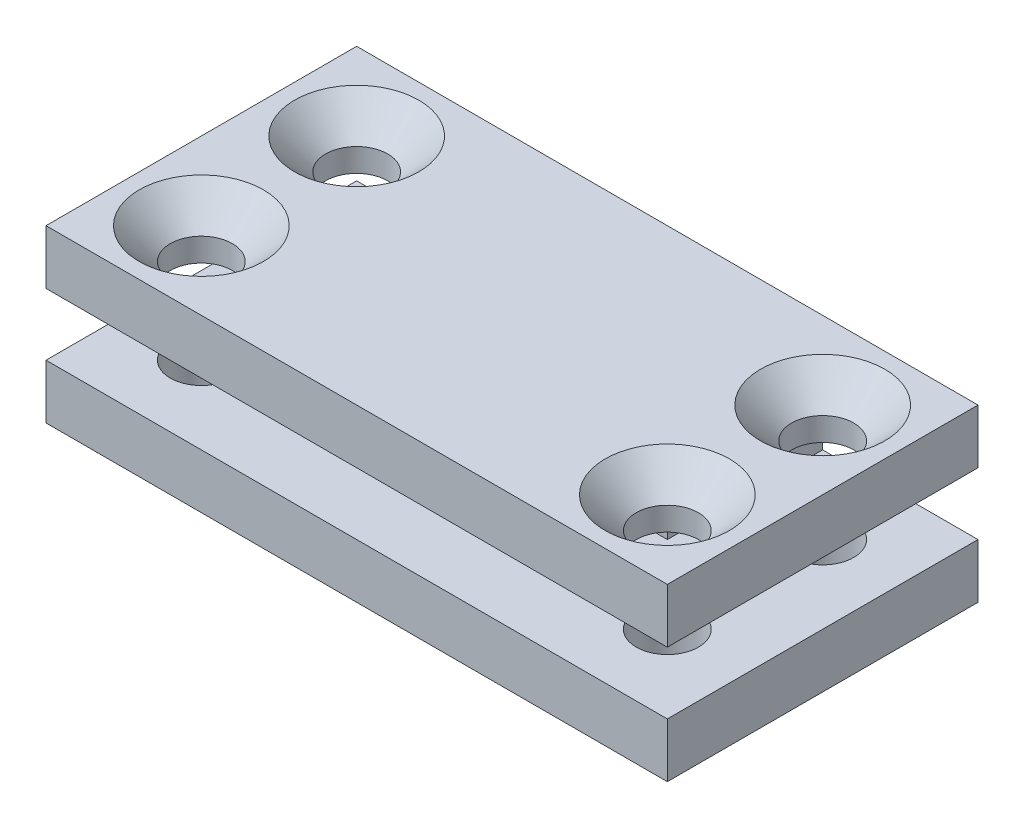
ISO-10303-21;
HEADER;
FILE_DESCRIPTION(('STEP AP214'),'2;1');
FILE_NAME('part.step','',(''),(''),'','','');
FILE_SCHEMA(('AUTOMOTIVE_DESIGN { 1 0 10303 214 1 1 1 1 }'));
ENDSEC;
DATA;
#1=APPLICATION_CONTEXT('core data for automotive mechanical design processes');
#2=APPLICATION_PROTOCOL_DEFINITION('international standard','automotive_design',2000,#1);
#3=PRODUCT_CONTEXT('',#1,'mechanical');
#4=PRODUCT('Part','Part','',(#3));
#5=PRODUCT_RELATED_PRODUCT_CATEGORY('part','',(#4));
#6=PRODUCT_DEFINITION_FORMATION('','',#4);
#7=PRODUCT_DEFINITION_CONTEXT('part definition',#1,'design');
#8=PRODUCT_DEFINITION('design','',#6,#7);
#9=PRODUCT_DEFINITION_SHAPE('','',#8);
#10=(LENGTH_UNIT() NAMED_UNIT(*) SI_UNIT(.MILLI.,.METRE.));
#11=(NAMED_UNIT(*) PLANE_ANGLE_UNIT() SI_UNIT($,.RADIAN.));
#12=(NAMED_UNIT(*) SI_UNIT($,.STERADIAN.) SOLID_ANGLE_UNIT());
#13=UNCERTAINTY_MEASURE_WITH_UNIT(LENGTH_MEASURE(1.E-05),#10,'distance_accuracy_value','');
#14=(GEOMETRIC_REPRESENTATION_CONTEXT(3) GLOBAL_UNCERTAINTY_ASSIGNED_CONTEXT((#13)) GLOBAL_UNIT_ASSIGNED_CONTEXT((#10,
#11,#12)) REPRESENTATION_CONTEXT('',''));
#15=CARTESIAN_POINT('',(0.,0.,0.));
#16=DIRECTION('',(0.,0.,1.));
#17=DIRECTION('',(1.,0.,0.));
#18=AXIS2_PLACEMENT_3D('',#15,#16,#17);
#19=CARTESIAN_POINT('',(0.,0.,5.));
#20=DIRECTION('',(0.,0.,1.));
#21=DIRECTION('',(1.,0.,0.));
#22=AXIS2_PLACEMENT_3D('',#19,#20,#21);
#23=PLANE('',#22);
#24=DIRECTION('',(0.,-1.,0.));
#25=VECTOR('',#24,1.);
#26=CARTESIAN_POINT('',(-10.,7.5,5.));
#27=LINE('',#26,#25);
#28=CARTESIAN_POINT('',(-10.,7.5,5.));
#29=VERTEX_POINT('',#28);
#30=CARTESIAN_POINT('',(-10.,3.50000000000001,5.));
#31=VERTEX_POINT('',#30);
#32=EDGE_CURVE('E195',#29,#31,#27,.T.);
#33=ORIENTED_EDGE('',*,*,#32,.T.);
#34=DIRECTION('',(-1.,0.,0.));
#35=VECTOR('',#34,1.);
#36=CARTESIAN_POINT('',(20.,3.50000000000004,5.));
#37=LINE('',#36,#35);
#38=CARTESIAN_POINT('',(0.,3.5,5.));
#39=VERTEX_POINT('',#38);
#40=EDGE_CURVE('E52',#39,#31,#37,.T.);
#41=ORIENTED_EDGE('',*,*,#40,.F.);
#42=CARTESIAN_POINT('',(0.,5.,5.));
#43=DIRECTION('',(0.,0.,1.));
#44=DIRECTION('',(1.,0.,0.));
#45=AXIS2_PLACEMENT_3D('',#42,#43,#44);
#46=CIRCLE('',#45,1.5);
#47=EDGE_CURVE('E190',#39,#39,#46,.T.);
#48=ORIENTED_EDGE('',*,*,#47,.F.);
#49=CARTESIAN_POINT('',(10.,3.50000000000004,5.));
#50=VERTEX_POINT('',#49);
#51=EDGE_CURVE('E164',#50,#39,#37,.T.);
#52=ORIENTED_EDGE('',*,*,#51,.F.);
#53=DIRECTION('',(0.,1.,0.));
#54=VECTOR('',#53,1.);
#55=CARTESIAN_POINT('',(10.,7.5,5.));
#56=LINE('',#55,#54);
#57=CARTESIAN_POINT('',(10.,7.5,5.));
#58=VERTEX_POINT('',#57);
#59=EDGE_CURVE('E60',#50,#58,#56,.T.);
#60=ORIENTED_EDGE('',*,*,#59,.T.);
#61=DIRECTION('',(1.,0.,0.));
#62=VECTOR('',#61,1.);
#63=CARTESIAN_POINT('',(-20.,7.5,5.));
#64=LINE('',#63,#62);
#65=EDGE_CURVE('E108',#29,#58,#64,.T.);
#66=ORIENTED_EDGE('',*,*,#65,.F.);
#67=EDGE_LOOP('',(#33,#41,#48,#52,#60,#66));
#68=FACE_BOUND('',#67,.T.);
#69=ADVANCED_FACE('F36',(#68),#23,.T.);
#70=CARTESIAN_POINT('',(0.,0.,-5.));
#71=DIRECTION('',(0.,0.,1.));
#72=DIRECTION('',(1.,0.,0.));
#73=AXIS2_PLACEMENT_3D('',#70,#71,#72);
#74=PLANE('',#73);
#75=DIRECTION('',(0.,-1.,0.));
#76=VECTOR('',#75,1.);
#77=CARTESIAN_POINT('',(-20.,11.,-5.));
#78=LINE('',#77,#76);
#79=CARTESIAN_POINT('',(-20.,11.,-5.));
#80=VERTEX_POINT('',#79);
#81=CARTESIAN_POINT('',(-20.,7.5,-5.));
#82=VERTEX_POINT('',#81);
#83=EDGE_CURVE('E192',#80,#82,#78,.T.);
#84=ORIENTED_EDGE('',*,*,#83,.F.);
#85=DIRECTION('',(-1.,0.,0.));
#86=VECTOR('',#85,1.);
#87=CARTESIAN_POINT('',(20.,11.,-5.));
#88=LINE('',#87,#86);
#89=CARTESIAN_POINT('',(20.,11.,-5.));
#90=VERTEX_POINT('',#89);
#91=EDGE_CURVE('E105',#90,#80,#88,.T.);
#92=ORIENTED_EDGE('',*,*,#91,.F.);
#93=DIRECTION('',(0.,1.,0.));
#94=VECTOR('',#93,1.);
#95=CARTESIAN_POINT('',(20.,11.,-5.));
#96=LINE('',#95,#94);
#97=CARTESIAN_POINT('',(20.,7.5,-5.));
#98=VERTEX_POINT('',#97);
#99=EDGE_CURVE('E219',#98,#90,#96,.T.);
#100=ORIENTED_EDGE('',*,*,#99,.F.);
#101=DIRECTION('',(1.,0.,0.));
#102=VECTOR('',#101,1.);
#103=CARTESIAN_POINT('',(20.,7.5,-5.));
#104=LINE('',#103,#102);
#105=CARTESIAN_POINT('',(10.,7.5,-5.));
#106=VERTEX_POINT('',#105);
#107=EDGE_CURVE('E217',#106,#98,#104,.T.);
#108=ORIENTED_EDGE('',*,*,#107,.F.);
#109=DIRECTION('',(0.,1.,0.));
#110=VECTOR('',#109,1.);
#111=CARTESIAN_POINT('',(10.,7.5,-5.));
#112=LINE('',#111,#110);
#113=CARTESIAN_POINT('',(10.,3.50000000000003,-5.));
#114=VERTEX_POINT('',#113);
#115=EDGE_CURVE('E215',#114,#106,#112,.T.);
#116=ORIENTED_EDGE('',*,*,#115,.F.);
#117=DIRECTION('',(-1.,0.,0.));
#118=VECTOR('',#117,1.);
#119=CARTESIAN_POINT('',(10.,3.50000000000003,-5.));
#120=LINE('',#119,#118);
#121=CARTESIAN_POINT('',(20.,3.50000000000004,-5.));
#122=VERTEX_POINT('',#121);
#123=EDGE_CURVE('E213',#122,#114,#120,.T.);
#124=ORIENTED_EDGE('',*,*,#123,.F.);
#125=DIRECTION('',(0.,1.,0.));
#126=VECTOR('',#125,1.);
#127=CARTESIAN_POINT('',(20.,3.50000000000004,-5.));
#128=LINE('',#127,#126);
#129=CARTESIAN_POINT('',(20.,0.,-5.));
#130=VERTEX_POINT('',#129);
#131=EDGE_CURVE('E144',#130,#122,#128,.T.);
#132=ORIENTED_EDGE('',*,*,#131,.F.);
#133=DIRECTION('',(1.,0.,0.));
#134=VECTOR('',#133,1.);
#135=CARTESIAN_POINT('',(20.,0.,-5.));
#136=LINE('',#135,#134);
#137=CARTESIAN_POINT('',(-20.,0.,-5.));
#138=VERTEX_POINT('',#137);
#139=EDGE_CURVE('E210',#138,#130,#136,.T.);
#140=ORIENTED_EDGE('',*,*,#139,.F.);
#141=DIRECTION('',(0.,-1.,0.));
#142=VECTOR('',#141,1.);
#143=CARTESIAN_POINT('',(-20.,3.5,-5.));
#144=LINE('',#143,#142);
#145=CARTESIAN_POINT('',(-20.,3.5,-5.));
#146=VERTEX_POINT('',#145);
#147=EDGE_CURVE('E207',#146,#138,#144,.T.);
#148=ORIENTED_EDGE('',*,*,#147,.F.);
#149=DIRECTION('',(-1.,0.,0.));
#150=VECTOR('',#149,1.);
#151=CARTESIAN_POINT('',(-10.,3.50000000000001,-5.));
#152=LINE('',#151,#150);
#153=CARTESIAN_POINT('',(-10.,3.50000000000001,-5.));
#154=VERTEX_POINT('',#153);
#155=EDGE_CURVE('E205',#154,#146,#152,.T.);
#156=ORIENTED_EDGE('',*,*,#155,.F.);
#157=DIRECTION('',(0.,-1.,0.));
#158=VECTOR('',#157,1.);
#159=CARTESIAN_POINT('',(-10.,7.5,-5.));
#160=LINE('',#159,#158);
#161=CARTESIAN_POINT('',(-10.,7.5,-5.));
#162=VERTEX_POINT('',#161);
#163=EDGE_CURVE('E203',#162,#154,#160,.T.);
#164=ORIENTED_EDGE('',*,*,#163,.F.);
#165=DIRECTION('',(1.,0.,0.));
#166=VECTOR('',#165,1.);
#167=CARTESIAN_POINT('',(-20.,7.5,-5.));
#168=LINE('',#167,#166);
#169=EDGE_CURVE('E201',#82,#162,#168,.T.);
#170=ORIENTED_EDGE('',*,*,#169,.F.);
#171=EDGE_LOOP('',(#84,#92,#100,#108,#116,#124,#132,#140,#148,#156,#164,#170));
#172=FACE_BOUND('',#171,.T.);
#173=CARTESIAN_POINT('',(0.,5.,-5.));
#174=DIRECTION('',(0.,0.,1.));
#175=DIRECTION('',(1.,0.,0.));
#176=AXIS2_PLACEMENT_3D('',#173,#174,#175);
#177=CIRCLE('',#176,1.5);
#178=CARTESIAN_POINT('',(1.5,5.,-5.));
#179=VERTEX_POINT('',#178);
#180=EDGE_CURVE('E186',#179,#179,#177,.T.);
#181=ORIENTED_EDGE('',*,*,#180,.T.);
#182=EDGE_LOOP('',(#181));
#183=FACE_BOUND('',#182,.T.);
#184=ADVANCED_FACE('F283',(#172,#183),#74,.F.);
#185=CARTESIAN_POINT('',(-20.,11.,5.));
#186=DIRECTION('',(1.,0.,0.));
#187=DIRECTION('',(0.,1.,0.));
#188=AXIS2_PLACEMENT_3D('',#185,#186,#187);
#189=PLANE('',#188);
#190=ORIENTED_EDGE('',*,*,#83,.T.);
#191=DIRECTION('',(0.,0.,-1.));
#192=VECTOR('',#191,1.);
#193=CARTESIAN_POINT('',(-20.,7.5,5.));
#194=LINE('',#193,#192);
#195=CARTESIAN_POINT('',(-20.,7.5,15.));
#196=VERTEX_POINT('',#195);
#197=EDGE_CURVE('E189',#196,#82,#194,.T.);
#198=ORIENTED_EDGE('',*,*,#197,.F.);
#199=DIRECTION('',(0.,-1.,0.));
#200=VECTOR('',#199,1.);
#201=CARTESIAN_POINT('',(-20.,11.,15.));
#202=LINE('',#201,#200);
#203=CARTESIAN_POINT('',(-20.,11.,15.));
#204=VERTEX_POINT('',#203);
#205=EDGE_CURVE('E173',#204,#196,#202,.T.);
#206=ORIENTED_EDGE('',*,*,#205,.F.);
#207=DIRECTION('',(0.,0.,-1.));
#208=VECTOR('',#207,1.);
#209=CARTESIAN_POINT('',(-20.,11.,5.));
#210=LINE('',#209,#208);
#211=EDGE_CURVE('E198',#204,#80,#210,.T.);
#212=ORIENTED_EDGE('',*,*,#211,.T.);
#213=EDGE_LOOP('',(#190,#198,#206,#212));
#214=FACE_BOUND('',#213,.T.);
#215=ADVANCED_FACE('F288',(#214),#189,.F.);
#216=CARTESIAN_POINT('',(-10.,7.5,5.));
#217=DIRECTION('',(1.,0.,0.));
#218=DIRECTION('',(0.,1.,0.));
#219=AXIS2_PLACEMENT_3D('',#216,#217,#218);
#220=PLANE('',#219);
#221=ORIENTED_EDGE('',*,*,#163,.T.);
#222=DIRECTION('',(0.,0.,-1.));
#223=VECTOR('',#222,1.);
#224=CARTESIAN_POINT('',(-10.,3.50000000000001,5.));
#225=LINE('',#224,#223);
#226=EDGE_CURVE('E238',#31,#154,#225,.T.);
#227=ORIENTED_EDGE('',*,*,#226,.F.);
#228=ORIENTED_EDGE('',*,*,#32,.F.);
#229=DIRECTION('',(0.,0.,-1.));
#230=VECTOR('',#229,1.);
#231=CARTESIAN_POINT('',(-10.,7.5,5.));
#232=LINE('',#231,#230);
#233=EDGE_CURVE('E241',#29,#162,#232,.T.);
#234=ORIENTED_EDGE('',*,*,#233,.T.);
#235=EDGE_LOOP('',(#221,#227,#228,#234));
#236=FACE_BOUND('',#235,.T.);
#237=ADVANCED_FACE('F323',(#236),#220,.F.);
#238=CARTESIAN_POINT('',(-20.,3.5,5.));
#239=DIRECTION('',(1.,0.,0.));
#240=DIRECTION('',(0.,1.,0.));
#241=AXIS2_PLACEMENT_3D('',#238,#239,#240);
#242=PLANE('',#241);
#243=ORIENTED_EDGE('',*,*,#147,.T.);
#244=DIRECTION('',(0.,0.,-1.));
#245=VECTOR('',#244,1.);
#246=CARTESIAN_POINT('',(-20.,0.,5.));
#247=LINE('',#246,#245);
#248=CARTESIAN_POINT('',(-20.,0.,15.));
#249=VERTEX_POINT('',#248);
#250=EDGE_CURVE('E234',#249,#138,#247,.T.);
#251=ORIENTED_EDGE('',*,*,#250,.F.);
#252=DIRECTION('',(0.,-1.,0.));
#253=VECTOR('',#252,1.);
#254=CARTESIAN_POINT('',(-20.,3.50000000000004,15.));
#255=LINE('',#254,#253);
#256=CARTESIAN_POINT('',(-20.,3.50000000000004,15.));
#257=VERTEX_POINT('',#256);
#258=EDGE_CURVE('E158',#257,#249,#255,.T.);
#259=ORIENTED_EDGE('',*,*,#258,.F.);
#260=DIRECTION('',(0.,0.,-1.));
#261=VECTOR('',#260,1.);
#262=CARTESIAN_POINT('',(-20.,3.5,5.));
#263=LINE('',#262,#261);
#264=EDGE_CURVE('E154',#257,#146,#263,.T.);
#265=ORIENTED_EDGE('',*,*,#264,.T.);
#266=EDGE_LOOP('',(#243,#251,#259,#265));
#267=FACE_BOUND('',#266,.T.);
#268=ADVANCED_FACE('F319',(#267),#242,.F.);
#269=CARTESIAN_POINT('',(20.,0.,5.));
#270=DIRECTION('',(0.,1.,0.));
#271=DIRECTION('',(-1.,0.,0.));
#272=AXIS2_PLACEMENT_3D('',#269,#270,#271);
#273=PLANE('',#272);
#274=CARTESIAN_POINT('',(15.,0.,0.));
#275=DIRECTION('',(0.,1.,0.));
#276=DIRECTION('',(0.,0.,-1.));
#277=AXIS2_PLACEMENT_3D('',#274,#275,#276);
#278=CIRCLE('',#277,2.);
#279=CARTESIAN_POINT('',(15.,0.,-2.));
#280=VERTEX_POINT('',#279);
#281=EDGE_CURVE('E371',#280,#280,#278,.T.);
#282=ORIENTED_EDGE('',*,*,#281,.T.);
#283=EDGE_LOOP('',(#282));
#284=FACE_BOUND('',#283,.T.);
#285=CARTESIAN_POINT('',(-15.,0.,10.));
#286=DIRECTION('',(0.,1.,0.));
#287=DIRECTION('',(0.,0.,1.));
#288=AXIS2_PLACEMENT_3D('',#285,#286,#287);
#289=CIRCLE('',#288,2.);
#290=CARTESIAN_POINT('',(-15.,0.,12.));
#291=VERTEX_POINT('',#290);
#292=EDGE_CURVE('E622',#291,#291,#289,.T.);
#293=ORIENTED_EDGE('',*,*,#292,.T.);
#294=EDGE_LOOP('',(#293));
#295=FACE_BOUND('',#294,.T.);
#296=CARTESIAN_POINT('',(15.,0.,10.));
#297=DIRECTION('',(0.,1.,0.));
#298=DIRECTION('',(0.,0.,-1.));
#299=AXIS2_PLACEMENT_3D('',#296,#297,#298);
#300=CIRCLE('',#299,2.);
#301=CARTESIAN_POINT('',(15.,0.,8.));
#302=VERTEX_POINT('',#301);
#303=EDGE_CURVE('E624',#302,#302,#300,.T.);
#304=ORIENTED_EDGE('',*,*,#303,.T.);
#305=EDGE_LOOP('',(#304));
#306=FACE_BOUND('',#305,.T.);
#307=CARTESIAN_POINT('',(-15.,0.,0.));
#308=DIRECTION('',(0.,1.,0.));
#309=DIRECTION('',(0.,0.,1.));
#310=AXIS2_PLACEMENT_3D('',#307,#308,#309);
#311=CIRCLE('',#310,2.);
#312=CARTESIAN_POINT('',(-15.,0.,2.));
#313=VERTEX_POINT('',#312);
#314=EDGE_CURVE('E365',#313,#313,#311,.T.);
#315=ORIENTED_EDGE('',*,*,#314,.T.);
#316=EDGE_LOOP('',(#315));
#317=FACE_BOUND('',#316,.T.);
#318=ORIENTED_EDGE('',*,*,#139,.T.);
#319=DIRECTION('',(0.,0.,-1.));
#320=VECTOR('',#319,1.);
#321=CARTESIAN_POINT('',(20.,0.,5.));
#322=LINE('',#321,#320);
#323=CARTESIAN_POINT('',(20.,0.,15.));
#324=VERTEX_POINT('',#323);
#325=EDGE_CURVE('E147',#324,#130,#322,.T.);
#326=ORIENTED_EDGE('',*,*,#325,.F.);
#327=DIRECTION('',(1.,0.,0.));
#328=VECTOR('',#327,1.);
#329=CARTESIAN_POINT('',(20.,0.,15.));
#330=LINE('',#329,#328);
#331=EDGE_CURVE('E163',#249,#324,#330,.T.);
#332=ORIENTED_EDGE('',*,*,#331,.F.);
#333=ORIENTED_EDGE('',*,*,#250,.T.);
#334=EDGE_LOOP('',(#318,#326,#332,#333));
#335=FACE_BOUND('',#334,.T.);
#336=ADVANCED_FACE('F316',(#284,#295,#306,#317,#335),#273,.F.);
#337=CARTESIAN_POINT('',(20.,3.50000000000004,5.));
#338=DIRECTION('',(-1.,0.,0.));
#339=DIRECTION('',(0.,-1.,0.));
#340=AXIS2_PLACEMENT_3D('',#337,#338,#339);
#341=PLANE('',#340);
#342=ORIENTED_EDGE('',*,*,#131,.T.);
#343=DIRECTION('',(0.,0.,-1.));
#344=VECTOR('',#343,1.);
#345=CARTESIAN_POINT('',(20.,3.50000000000004,5.));
#346=LINE('',#345,#344);
#347=CARTESIAN_POINT('',(20.,3.50000000000004,15.));
#348=VERTEX_POINT('',#347);
#349=EDGE_CURVE('E137',#348,#122,#346,.T.);
#350=ORIENTED_EDGE('',*,*,#349,.F.);
#351=DIRECTION('',(0.,1.,0.));
#352=VECTOR('',#351,1.);
#353=CARTESIAN_POINT('',(20.,3.50000000000004,15.));
#354=LINE('',#353,#352);
#355=EDGE_CURVE('E142',#324,#348,#354,.T.);
#356=ORIENTED_EDGE('',*,*,#355,.F.);
#357=ORIENTED_EDGE('',*,*,#325,.T.);
#358=EDGE_LOOP('',(#342,#350,#356,#357));
#359=FACE_BOUND('',#358,.T.);
#360=ADVANCED_FACE('F139',(#359),#341,.F.);
#361=CARTESIAN_POINT('',(10.,3.50000000000003,5.));
#362=DIRECTION('',(0.,-1.,0.));
#363=DIRECTION('',(1.,0.,0.));
#364=AXIS2_PLACEMENT_3D('',#361,#362,#363);
#365=PLANE('',#364);
#366=CARTESIAN_POINT('',(15.,3.50000000000003,0.));
#367=DIRECTION('',(0.,-1.,0.));
#368=DIRECTION('',(1.,0.,0.));
#369=AXIS2_PLACEMENT_3D('',#366,#367,#368);
#370=CIRCLE('',#369,2.);
#371=CARTESIAN_POINT('',(17.,3.50000000000003,0.));
#372=VERTEX_POINT('',#371);
#373=EDGE_CURVE('E169',#372,#372,#370,.F.);
#374=ORIENTED_EDGE('',*,*,#373,.F.);
#375=EDGE_LOOP('',(#374));
#376=FACE_BOUND('',#375,.T.);
#377=CARTESIAN_POINT('',(-15.,3.5,10.));
#378=DIRECTION('',(0.,-1.,0.));
#379=DIRECTION('',(1.,0.,0.));
#380=AXIS2_PLACEMENT_3D('',#377,#378,#379);
#381=CIRCLE('',#380,2.);
#382=CARTESIAN_POINT('',(-13.,3.5,10.));
#383=VERTEX_POINT('',#382);
#384=EDGE_CURVE('E383',#383,#383,#381,.F.);
#385=ORIENTED_EDGE('',*,*,#384,.F.);
#386=EDGE_LOOP('',(#385));
#387=FACE_BOUND('',#386,.T.);
#388=CARTESIAN_POINT('',(15.,3.50000000000003,10.));
#389=DIRECTION('',(0.,-1.,0.));
#390=DIRECTION('',(1.,0.,0.));
#391=AXIS2_PLACEMENT_3D('',#388,#389,#390);
#392=CIRCLE('',#391,2.);
#393=CARTESIAN_POINT('',(17.,3.50000000000003,10.));
#394=VERTEX_POINT('',#393);
#395=EDGE_CURVE('E377',#394,#394,#392,.F.);
#396=ORIENTED_EDGE('',*,*,#395,.F.);
#397=EDGE_LOOP('',(#396));
#398=FACE_BOUND('',#397,.T.);
#399=CARTESIAN_POINT('',(-15.,3.5,0.));
#400=DIRECTION('',(0.,-1.,0.));
#401=DIRECTION('',(1.,0.,0.));
#402=AXIS2_PLACEMENT_3D('',#399,#400,#401);
#403=CIRCLE('',#402,2.);
#404=CARTESIAN_POINT('',(-13.,3.5,0.));
#405=VERTEX_POINT('',#404);
#406=EDGE_CURVE('E364',#405,#405,#403,.F.);
#407=ORIENTED_EDGE('',*,*,#406,.F.);
#408=EDGE_LOOP('',(#407));
#409=FACE_BOUND('',#408,.T.);
#410=ORIENTED_EDGE('',*,*,#123,.T.);
#411=DIRECTION('',(0.,0.,-1.));
#412=VECTOR('',#411,1.);
#413=CARTESIAN_POINT('',(10.,3.50000000000003,5.));
#414=LINE('',#413,#412);
#415=EDGE_CURVE('E148',#50,#114,#414,.T.);
#416=ORIENTED_EDGE('',*,*,#415,.F.);
#417=ORIENTED_EDGE('',*,*,#51,.T.);
#418=ORIENTED_EDGE('',*,*,#40,.T.);
#419=ORIENTED_EDGE('',*,*,#226,.T.);
#420=ORIENTED_EDGE('',*,*,#155,.T.);
#421=ORIENTED_EDGE('',*,*,#264,.F.);
#422=DIRECTION('',(-1.,0.,0.));
#423=VECTOR('',#422,1.);
#424=CARTESIAN_POINT('',(20.,3.50000000000004,15.));
#425=LINE('',#424,#423);
#426=EDGE_CURVE('E151',#348,#257,#425,.T.);
#427=ORIENTED_EDGE('',*,*,#426,.F.);
#428=ORIENTED_EDGE('',*,*,#349,.T.);
#429=EDGE_LOOP('',(#410,#416,#417,#418,#419,#420,#421,#427,#428));
#430=FACE_BOUND('',#429,.T.);
#431=ADVANCED_FACE('F152',(#376,#387,#398,#409,#430),#365,.F.);
#432=CARTESIAN_POINT('',(10.,7.5,5.));
#433=DIRECTION('',(-1.,0.,0.));
#434=DIRECTION('',(0.,-1.,0.));
#435=AXIS2_PLACEMENT_3D('',#432,#433,#434);
#436=PLANE('',#435);
#437=ORIENTED_EDGE('',*,*,#115,.T.);
#438=DIRECTION('',(0.,0.,-1.));
#439=VECTOR('',#438,1.);
#440=CARTESIAN_POINT('',(10.,7.5,5.));
#441=LINE('',#440,#439);
#442=EDGE_CURVE('E228',#58,#106,#441,.T.);
#443=ORIENTED_EDGE('',*,*,#442,.F.);
#444=ORIENTED_EDGE('',*,*,#59,.F.);
#445=ORIENTED_EDGE('',*,*,#415,.T.);
#446=EDGE_LOOP('',(#437,#443,#444,#445));
#447=FACE_BOUND('',#446,.T.);
#448=ADVANCED_FACE('F306',(#447),#436,.F.);
#449=CARTESIAN_POINT('',(20.,7.5,5.));
#450=DIRECTION('',(0.,1.,0.));
#451=DIRECTION('',(0.,0.,1.));
#452=AXIS2_PLACEMENT_3D('',#449,#450,#451);
#453=PLANE('',#452);
#454=CARTESIAN_POINT('',(15.,7.5,0.));
#455=DIRECTION('',(0.,1.,0.));
#456=DIRECTION('',(0.,0.,1.));
#457=AXIS2_PLACEMENT_3D('',#454,#455,#456);
#458=CIRCLE('',#457,2.);
#459=CARTESIAN_POINT('',(15.,7.5,2.));
#460=VERTEX_POINT('',#459);
#461=EDGE_CURVE('E385',#460,#460,#458,.F.);
#462=ORIENTED_EDGE('',*,*,#461,.F.);
#463=EDGE_LOOP('',(#462));
#464=FACE_BOUND('',#463,.T.);
#465=CARTESIAN_POINT('',(-15.,7.5,10.));
#466=DIRECTION('',(0.,1.,0.));
#467=DIRECTION('',(0.,0.,1.));
#468=AXIS2_PLACEMENT_3D('',#465,#466,#467);
#469=CIRCLE('',#468,2.);
#470=CARTESIAN_POINT('',(-15.,7.5,12.));
#471=VERTEX_POINT('',#470);
#472=EDGE_CURVE('E380',#471,#471,#469,.F.);
#473=ORIENTED_EDGE('',*,*,#472,.F.);
#474=EDGE_LOOP('',(#473));
#475=FACE_BOUND('',#474,.T.);
#476=CARTESIAN_POINT('',(15.,7.5,10.));
#477=DIRECTION('',(0.,1.,0.));
#478=DIRECTION('',(0.,0.,1.));
#479=AXIS2_PLACEMENT_3D('',#476,#477,#478);
#480=CIRCLE('',#479,2.);
#481=CARTESIAN_POINT('',(15.,7.5,12.));
#482=VERTEX_POINT('',#481);
#483=EDGE_CURVE('E368',#482,#482,#480,.F.);
#484=ORIENTED_EDGE('',*,*,#483,.F.);
#485=EDGE_LOOP('',(#484));
#486=FACE_BOUND('',#485,.T.);
#487=CARTESIAN_POINT('',(-15.,7.5,0.));
#488=DIRECTION('',(0.,1.,0.));
#489=DIRECTION('',(0.,0.,1.));
#490=AXIS2_PLACEMENT_3D('',#487,#488,#489);
#491=CIRCLE('',#490,2.);
#492=CARTESIAN_POINT('',(-15.,7.5,2.));
#493=VERTEX_POINT('',#492);
#494=EDGE_CURVE('E362',#493,#493,#491,.F.);
#495=ORIENTED_EDGE('',*,*,#494,.F.);
#496=EDGE_LOOP('',(#495));
#497=FACE_BOUND('',#496,.T.);
#498=ORIENTED_EDGE('',*,*,#107,.T.);
#499=DIRECTION('',(0.,0.,-1.));
#500=VECTOR('',#499,1.);
#501=CARTESIAN_POINT('',(20.,7.5,5.));
#502=LINE('',#501,#500);
#503=CARTESIAN_POINT('',(20.,7.5,15.));
#504=VERTEX_POINT('',#503);
#505=EDGE_CURVE('E225',#504,#98,#502,.T.);
#506=ORIENTED_EDGE('',*,*,#505,.F.);
#507=DIRECTION('',(1.,0.,0.));
#508=VECTOR('',#507,1.);
#509=CARTESIAN_POINT('',(-20.,7.5,15.));
#510=LINE('',#509,#508);
#511=EDGE_CURVE('E177',#196,#504,#510,.T.);
#512=ORIENTED_EDGE('',*,*,#511,.F.);
#513=ORIENTED_EDGE('',*,*,#197,.T.);
#514=ORIENTED_EDGE('',*,*,#169,.T.);
#515=ORIENTED_EDGE('',*,*,#233,.F.);
#516=ORIENTED_EDGE('',*,*,#65,.T.);
#517=ORIENTED_EDGE('',*,*,#442,.T.);
#518=EDGE_LOOP('',(#498,#506,#512,#513,#514,#515,#516,#517));
#519=FACE_BOUND('',#518,.T.);
#520=ADVANCED_FACE('F302',(#464,#475,#486,#497,#519),#453,.F.);
#521=CARTESIAN_POINT('',(20.,11.,5.));
#522=DIRECTION('',(-1.,0.,0.));
#523=DIRECTION('',(0.,-1.,0.));
#524=AXIS2_PLACEMENT_3D('',#521,#522,#523);
#525=PLANE('',#524);
#526=ORIENTED_EDGE('',*,*,#99,.T.);
#527=DIRECTION('',(0.,0.,-1.));
#528=VECTOR('',#527,1.);
#529=CARTESIAN_POINT('',(20.,11.,5.));
#530=LINE('',#529,#528);
#531=CARTESIAN_POINT('',(20.,11.,15.));
#532=VERTEX_POINT('',#531);
#533=EDGE_CURVE('E223',#532,#90,#530,.T.);
#534=ORIENTED_EDGE('',*,*,#533,.F.);
#535=DIRECTION('',(0.,1.,0.));
#536=VECTOR('',#535,1.);
#537=CARTESIAN_POINT('',(20.,11.,15.));
#538=LINE('',#537,#536);
#539=EDGE_CURVE('E180',#504,#532,#538,.T.);
#540=ORIENTED_EDGE('',*,*,#539,.F.);
#541=ORIENTED_EDGE('',*,*,#505,.T.);
#542=EDGE_LOOP('',(#526,#534,#540,#541));
#543=FACE_BOUND('',#542,.T.);
#544=ADVANCED_FACE('F298',(#543),#525,.F.);
#545=CARTESIAN_POINT('',(20.,11.,5.));
#546=DIRECTION('',(0.,-1.,0.));
#547=DIRECTION('',(0.,0.,-1.));
#548=AXIS2_PLACEMENT_3D('',#545,#546,#547);
#549=PLANE('',#548);
#550=CARTESIAN_POINT('',(-15.,11.,0.));
#551=DIRECTION('',(0.,-1.,0.));
#552=DIRECTION('',(0.,0.,-1.));
#553=AXIS2_PLACEMENT_3D('',#550,#551,#552);
#554=CIRCLE('',#553,4.00000000000002);
#555=CARTESIAN_POINT('',(-15.,11.,-4.00000000000002));
#556=VERTEX_POINT('',#555);
#557=EDGE_CURVE('E257',#556,#556,#554,.T.);
#558=ORIENTED_EDGE('',*,*,#557,.T.);
#559=EDGE_LOOP('',(#558));
#560=FACE_BOUND('',#559,.T.);
#561=CARTESIAN_POINT('',(-15.,11.,10.));
#562=DIRECTION('',(0.,-1.,0.));
#563=DIRECTION('',(0.,0.,-1.));
#564=AXIS2_PLACEMENT_3D('',#561,#562,#563);
#565=CIRCLE('',#564,4.00000000000002);
#566=CARTESIAN_POINT('',(-15.,11.,5.99999999999997));
#567=VERTEX_POINT('',#566);
#568=EDGE_CURVE('E254',#567,#567,#565,.T.);
#569=ORIENTED_EDGE('',*,*,#568,.T.);
#570=EDGE_LOOP('',(#569));
#571=FACE_BOUND('',#570,.T.);
#572=CARTESIAN_POINT('',(15.,11.,10.));
#573=DIRECTION('',(0.,-1.,0.));
#574=DIRECTION('',(0.,0.,-1.));
#575=AXIS2_PLACEMENT_3D('',#572,#573,#574);
#576=CIRCLE('',#575,4.00000000000002);
#577=CARTESIAN_POINT('',(15.,11.,5.99999999999997));
#578=VERTEX_POINT('',#577);
#579=EDGE_CURVE('E251',#578,#578,#576,.T.);
#580=ORIENTED_EDGE('',*,*,#579,.T.);
#581=EDGE_LOOP('',(#580));
#582=FACE_BOUND('',#581,.T.);
#583=CARTESIAN_POINT('',(15.,11.,0.));
#584=DIRECTION('',(0.,-1.,0.));
#585=DIRECTION('',(0.,0.,-1.));
#586=AXIS2_PLACEMENT_3D('',#583,#584,#585);
#587=CIRCLE('',#586,4.00000000000002);
#588=CARTESIAN_POINT('',(15.,11.,-4.00000000000002));
#589=VERTEX_POINT('',#588);
#590=EDGE_CURVE('E248',#589,#589,#587,.T.);
#591=ORIENTED_EDGE('',*,*,#590,.T.);
#592=EDGE_LOOP('',(#591));
#593=FACE_BOUND('',#592,.T.);
#594=ORIENTED_EDGE('',*,*,#91,.T.);
#595=ORIENTED_EDGE('',*,*,#211,.F.);
#596=DIRECTION('',(-1.,0.,0.));
#597=VECTOR('',#596,1.);
#598=CARTESIAN_POINT('',(-20.,11.,15.));
#599=LINE('',#598,#597);
#600=EDGE_CURVE('E183',#532,#204,#599,.T.);
#601=ORIENTED_EDGE('',*,*,#600,.F.);
#602=ORIENTED_EDGE('',*,*,#533,.T.);
#603=EDGE_LOOP('',(#594,#595,#601,#602));
#604=FACE_BOUND('',#603,.T.);
#605=ADVANCED_FACE('F295',(#560,#571,#582,#593,#604),#549,.F.);
#606=CARTESIAN_POINT('',(0.,5.,5.));
#607=DIRECTION('',(0.,0.,-1.));
#608=DIRECTION('',(-1.,0.,0.));
#609=AXIS2_PLACEMENT_3D('',#606,#607,#608);
#610=CYLINDRICAL_SURFACE('',#609,1.5);
#611=ORIENTED_EDGE('',*,*,#47,.T.);
#612=EDGE_LOOP('',(#611));
#613=FACE_BOUND('',#612,.T.);
#614=ORIENTED_EDGE('',*,*,#180,.F.);
#615=EDGE_LOOP('',(#614));
#616=FACE_BOUND('',#615,.T.);
#617=ADVANCED_FACE('F292',(#613,#616),#610,.F.);
#618=CARTESIAN_POINT('',(0.,0.,15.));
#619=DIRECTION('',(0.,0.,1.));
#620=DIRECTION('',(1.,0.,0.));
#621=AXIS2_PLACEMENT_3D('',#618,#619,#620);
#622=PLANE('',#621);
#623=ORIENTED_EDGE('',*,*,#205,.T.);
#624=ORIENTED_EDGE('',*,*,#511,.T.);
#625=ORIENTED_EDGE('',*,*,#539,.T.);
#626=ORIENTED_EDGE('',*,*,#600,.T.);
#627=EDGE_LOOP('',(#623,#624,#625,#626));
#628=FACE_BOUND('',#627,.T.);
#629=ADVANCED_FACE('F414',(#628),#622,.T.);
#630=CARTESIAN_POINT('',(0.,0.,15.));
#631=DIRECTION('',(0.,0.,-1.));
#632=DIRECTION('',(-1.,0.,0.));
#633=AXIS2_PLACEMENT_3D('',#630,#631,#632);
#634=PLANE('',#633);
#635=ORIENTED_EDGE('',*,*,#355,.T.);
#636=ORIENTED_EDGE('',*,*,#426,.T.);
#637=ORIENTED_EDGE('',*,*,#258,.T.);
#638=ORIENTED_EDGE('',*,*,#331,.T.);
#639=EDGE_LOOP('',(#635,#636,#637,#638));
#640=FACE_BOUND('',#639,.T.);
#641=ADVANCED_FACE('F161',(#640),#634,.F.);
#642=CARTESIAN_POINT('',(-15.,11.,0.));
#643=DIRECTION('',(0.,-1.,0.));
#644=DIRECTION('',(0.,0.,-1.));
#645=AXIS2_PLACEMENT_3D('',#642,#643,#644);
#646=CYLINDRICAL_SURFACE('',#645,2.);
#647=CARTESIAN_POINT('',(-15.,8.99999999999998,0.));
#648=DIRECTION('',(0.,-1.,0.));
#649=DIRECTION('',(0.,0.,-1.));
#650=AXIS2_PLACEMENT_3D('',#647,#648,#649);
#651=CIRCLE('',#650,2.);
#652=CARTESIAN_POINT('',(-15.,8.99999999999998,-2.));
#653=VERTEX_POINT('',#652);
#654=EDGE_CURVE('E188',#653,#653,#651,.F.);
#655=ORIENTED_EDGE('',*,*,#654,.T.);
#656=EDGE_LOOP('',(#655));
#657=FACE_BOUND('',#656,.T.);
#658=ORIENTED_EDGE('',*,*,#494,.T.);
#659=EDGE_LOOP('',(#658));
#660=FACE_BOUND('',#659,.T.);
#661=ADVANCED_FACE('F355',(#657,#660),#646,.F.);
#662=CARTESIAN_POINT('',(15.,11.,10.));
#663=DIRECTION('',(0.,-1.,0.));
#664=DIRECTION('',(0.,0.,-1.));
#665=AXIS2_PLACEMENT_3D('',#662,#663,#664);
#666=CYLINDRICAL_SURFACE('',#665,2.);
#667=CARTESIAN_POINT('',(15.,8.99999999999998,10.));
#668=DIRECTION('',(0.,-1.,0.));
#669=DIRECTION('',(0.,0.,-1.));
#670=AXIS2_PLACEMENT_3D('',#667,#668,#669);
#671=CIRCLE('',#670,2.);
#672=CARTESIAN_POINT('',(15.,8.99999999999998,8.));
#673=VERTEX_POINT('',#672);
#674=EDGE_CURVE('E45',#673,#673,#671,.F.);
#675=ORIENTED_EDGE('',*,*,#674,.T.);
#676=EDGE_LOOP('',(#675));
#677=FACE_BOUND('',#676,.T.);
#678=ORIENTED_EDGE('',*,*,#483,.T.);
#679=EDGE_LOOP('',(#678));
#680=FACE_BOUND('',#679,.T.);
#681=ADVANCED_FACE('F265',(#677,#680),#666,.F.);
#682=CARTESIAN_POINT('',(-15.,11.,10.));
#683=DIRECTION('',(0.,-1.,0.));
#684=DIRECTION('',(0.,0.,-1.));
#685=AXIS2_PLACEMENT_3D('',#682,#683,#684);
#686=CYLINDRICAL_SURFACE('',#685,2.);
#687=CARTESIAN_POINT('',(-15.,8.99999999999998,10.));
#688=DIRECTION('',(0.,-1.,0.));
#689=DIRECTION('',(0.,0.,-1.));
#690=AXIS2_PLACEMENT_3D('',#687,#688,#689);
#691=CIRCLE('',#690,2.);
#692=CARTESIAN_POINT('',(-15.,8.99999999999998,8.));
#693=VERTEX_POINT('',#692);
#694=EDGE_CURVE('E260',#693,#693,#691,.F.);
#695=ORIENTED_EDGE('',*,*,#694,.T.);
#696=EDGE_LOOP('',(#695));
#697=FACE_BOUND('',#696,.T.);
#698=ORIENTED_EDGE('',*,*,#472,.T.);
#699=EDGE_LOOP('',(#698));
#700=FACE_BOUND('',#699,.T.);
#701=ADVANCED_FACE('F408',(#697,#700),#686,.F.);
#702=CARTESIAN_POINT('',(15.,11.,0.));
#703=DIRECTION('',(0.,-1.,0.));
#704=DIRECTION('',(0.,0.,-1.));
#705=AXIS2_PLACEMENT_3D('',#702,#703,#704);
#706=CYLINDRICAL_SURFACE('',#705,2.);
#707=CARTESIAN_POINT('',(15.,8.99999999999998,0.));
#708=DIRECTION('',(0.,-1.,0.));
#709=DIRECTION('',(0.,0.,-1.));
#710=AXIS2_PLACEMENT_3D('',#707,#708,#709);
#711=CIRCLE('',#710,2.);
#712=CARTESIAN_POINT('',(15.,8.99999999999998,-2.));
#713=VERTEX_POINT('',#712);
#714=EDGE_CURVE('E11',#713,#713,#711,.F.);
#715=ORIENTED_EDGE('',*,*,#714,.T.);
#716=EDGE_LOOP('',(#715));
#717=FACE_BOUND('',#716,.T.);
#718=ORIENTED_EDGE('',*,*,#461,.T.);
#719=EDGE_LOOP('',(#718));
#720=FACE_BOUND('',#719,.T.);
#721=ADVANCED_FACE('F350',(#717,#720),#706,.F.);
#722=ORIENTED_EDGE('',*,*,#314,.F.);
#723=EDGE_LOOP('',(#722));
#724=FACE_BOUND('',#723,.T.);
#725=ORIENTED_EDGE('',*,*,#406,.T.);
#726=EDGE_LOOP('',(#725));
#727=FACE_BOUND('',#726,.T.);
#728=ADVANCED_FACE('F359',(#724,#727),#646,.F.);
#729=ORIENTED_EDGE('',*,*,#303,.F.);
#730=EDGE_LOOP('',(#729));
#731=FACE_BOUND('',#730,.T.);
#732=ORIENTED_EDGE('',*,*,#395,.T.);
#733=EDGE_LOOP('',(#732));
#734=FACE_BOUND('',#733,.T.);
#735=ADVANCED_FACE('F400',(#731,#734),#666,.F.);
#736=ORIENTED_EDGE('',*,*,#292,.F.);
#737=EDGE_LOOP('',(#736));
#738=FACE_BOUND('',#737,.T.);
#739=ORIENTED_EDGE('',*,*,#384,.T.);
#740=EDGE_LOOP('',(#739));
#741=FACE_BOUND('',#740,.T.);
#742=ADVANCED_FACE('F347',(#738,#741),#686,.F.);
#743=ORIENTED_EDGE('',*,*,#281,.F.);
#744=EDGE_LOOP('',(#743));
#745=FACE_BOUND('',#744,.T.);
#746=ORIENTED_EDGE('',*,*,#373,.T.);
#747=EDGE_LOOP('',(#746));
#748=FACE_BOUND('',#747,.T.);
#749=ADVANCED_FACE('F336',(#745,#748),#706,.F.);
#750=CARTESIAN_POINT('',(-15.,8.99999999999998,0.));
#751=DIRECTION('',(0.,1.,0.));
#752=DIRECTION('',(0.,0.,1.));
#753=AXIS2_PLACEMENT_3D('',#750,#751,#752);
#754=CONICAL_SURFACE('',#753,2.,0.78539816339745);
#755=ORIENTED_EDGE('',*,*,#557,.F.);
#756=EDGE_LOOP('',(#755));
#757=FACE_BOUND('',#756,.T.);
#758=ORIENTED_EDGE('',*,*,#654,.F.);
#759=EDGE_LOOP('',(#758));
#760=FACE_BOUND('',#759,.T.);
#761=ADVANCED_FACE('F277',(#757,#760),#754,.F.);
#762=CARTESIAN_POINT('',(-15.,8.99999999999998,10.));
#763=DIRECTION('',(0.,1.,0.));
#764=DIRECTION('',(0.,0.,1.));
#765=AXIS2_PLACEMENT_3D('',#762,#763,#764);
#766=CONICAL_SURFACE('',#765,2.,0.78539816339745);
#767=ORIENTED_EDGE('',*,*,#568,.F.);
#768=EDGE_LOOP('',(#767));
#769=FACE_BOUND('',#768,.T.);
#770=ORIENTED_EDGE('',*,*,#694,.F.);
#771=EDGE_LOOP('',(#770));
#772=FACE_BOUND('',#771,.T.);
#773=ADVANCED_FACE('F270',(#769,#772),#766,.F.);
#774=CARTESIAN_POINT('',(15.,8.99999999999998,10.));
#775=DIRECTION('',(0.,1.,0.));
#776=DIRECTION('',(0.,0.,1.));
#777=AXIS2_PLACEMENT_3D('',#774,#775,#776);
#778=CONICAL_SURFACE('',#777,2.,0.78539816339745);
#779=ORIENTED_EDGE('',*,*,#579,.F.);
#780=EDGE_LOOP('',(#779));
#781=FACE_BOUND('',#780,.T.);
#782=ORIENTED_EDGE('',*,*,#674,.F.);
#783=EDGE_LOOP('',(#782));
#784=FACE_BOUND('',#783,.T.);
#785=ADVANCED_FACE('F268',(#781,#784),#778,.F.);
#786=CARTESIAN_POINT('',(15.,8.99999999999998,0.));
#787=DIRECTION('',(0.,1.,0.));
#788=DIRECTION('',(0.,0.,1.));
#789=AXIS2_PLACEMENT_3D('',#786,#787,#788);
#790=CONICAL_SURFACE('',#789,2.,0.78539816339745);
#791=ORIENTED_EDGE('',*,*,#590,.F.);
#792=EDGE_LOOP('',(#791));
#793=FACE_BOUND('',#792,.T.);
#794=ORIENTED_EDGE('',*,*,#714,.F.);
#795=EDGE_LOOP('',(#794));
#796=FACE_BOUND('',#795,.T.);
#797=ADVANCED_FACE('F39',(#793,#796),#790,.F.);
#798=CLOSED_SHELL('',(#69,#184,#215,#237,#268,#336,#360,#431,#448,#520,#544,#605,#617,#629,#641,
#661,#681,#701,#721,#728,#735,#742,#749,#761,#773,#785,#797));
#799=MANIFOLD_SOLID_BREP('B2',#798);
#800=ADVANCED_BREP_SHAPE_REPRESENTATION('',(#18,#799),#14);
#801=SHAPE_DEFINITION_REPRESENTATION(#9,#800);
ENDSEC;
END-ISO-10303-21;
